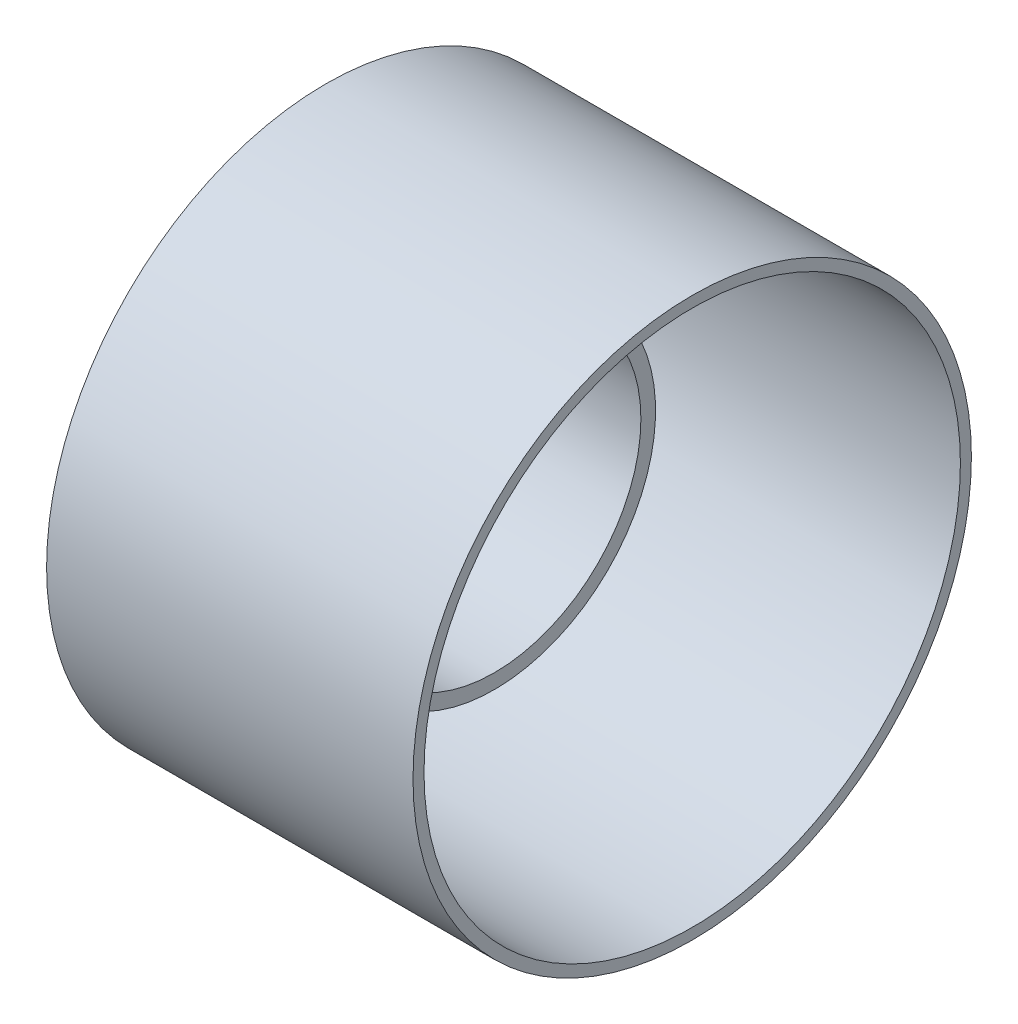
ISO-10303-21;
HEADER;
FILE_DESCRIPTION(('STEP AP214'),'2;1');
FILE_NAME('part.step','',(''),(''),'','','');
FILE_SCHEMA(('AUTOMOTIVE_DESIGN { 1 0 10303 214 1 1 1 1 }'));
ENDSEC;
DATA;
#1=APPLICATION_CONTEXT('core data for automotive mechanical design processes');
#2=APPLICATION_PROTOCOL_DEFINITION('international standard','automotive_design',2000,#1);
#3=PRODUCT_CONTEXT('',#1,'mechanical');
#4=PRODUCT('Part','Part','',(#3));
#5=PRODUCT_RELATED_PRODUCT_CATEGORY('part','',(#4));
#6=PRODUCT_DEFINITION_FORMATION('','',#4);
#7=PRODUCT_DEFINITION_CONTEXT('part definition',#1,'design');
#8=PRODUCT_DEFINITION('design','',#6,#7);
#9=PRODUCT_DEFINITION_SHAPE('','',#8);
#10=(LENGTH_UNIT() NAMED_UNIT(*) SI_UNIT(.MILLI.,.METRE.));
#11=(NAMED_UNIT(*) PLANE_ANGLE_UNIT() SI_UNIT($,.RADIAN.));
#12=(NAMED_UNIT(*) SI_UNIT($,.STERADIAN.) SOLID_ANGLE_UNIT());
#13=UNCERTAINTY_MEASURE_WITH_UNIT(LENGTH_MEASURE(1.E-05),#10,'distance_accuracy_value','');
#14=(GEOMETRIC_REPRESENTATION_CONTEXT(3) GLOBAL_UNCERTAINTY_ASSIGNED_CONTEXT((#13)) GLOBAL_UNIT_ASSIGNED_CONTEXT((#10,
#11,#12)) REPRESENTATION_CONTEXT('',''));
#15=CARTESIAN_POINT('',(0.,0.,0.));
#16=DIRECTION('',(0.,0.,1.));
#17=DIRECTION('',(1.,0.,0.));
#18=AXIS2_PLACEMENT_3D('',#15,#16,#17);
#19=CARTESIAN_POINT('',(100.,76.2,0.));
#20=DIRECTION('',(-1.,0.,0.));
#21=DIRECTION('',(0.,0.,1.));
#22=AXIS2_PLACEMENT_3D('',#19,#20,#21);
#23=PLANE('',#22);
#24=CARTESIAN_POINT('',(100.,0.,0.));
#25=DIRECTION('',(-1.,0.,0.));
#26=DIRECTION('',(0.,0.,1.));
#27=AXIS2_PLACEMENT_3D('',#24,#25,#26);
#28=CIRCLE('',#27,76.2);
#29=CARTESIAN_POINT('',(100.,0.,76.2));
#30=VERTEX_POINT('',#29);
#31=EDGE_CURVE('E10',#30,#30,#28,.T.);
#32=ORIENTED_EDGE('',*,*,#31,.F.);
#33=EDGE_LOOP('',(#32));
#34=FACE_BOUND('',#33,.T.);
#35=CARTESIAN_POINT('',(100.,0.,0.));
#36=DIRECTION('',(-1.,0.,0.));
#37=DIRECTION('',(0.,0.,1.));
#38=AXIS2_PLACEMENT_3D('',#35,#36,#37);
#39=CIRCLE('',#38,73.2);
#40=CARTESIAN_POINT('',(100.,0.,73.2));
#41=VERTEX_POINT('',#40);
#42=EDGE_CURVE('E40',#41,#41,#39,.T.);
#43=ORIENTED_EDGE('',*,*,#42,.T.);
#44=EDGE_LOOP('',(#43));
#45=FACE_BOUND('',#44,.T.);
#46=ADVANCED_FACE('F34',(#34,#45),#23,.F.);
#47=CARTESIAN_POINT('',(0.,0.,0.));
#48=DIRECTION('',(-1.,0.,0.));
#49=DIRECTION('',(0.,0.,1.));
#50=AXIS2_PLACEMENT_3D('',#47,#48,#49);
#51=CYLINDRICAL_SURFACE('',#50,73.2);
#52=ORIENTED_EDGE('',*,*,#42,.F.);
#53=EDGE_LOOP('',(#52));
#54=FACE_BOUND('',#53,.T.);
#55=CARTESIAN_POINT('',(8.00000000000001,0.,0.));
#56=DIRECTION('',(-1.,0.,0.));
#57=DIRECTION('',(0.,0.,1.));
#58=AXIS2_PLACEMENT_3D('',#55,#56,#57);
#59=CIRCLE('',#58,73.2);
#60=CARTESIAN_POINT('',(8.00000000000001,0.,73.2));
#61=VERTEX_POINT('',#60);
#62=EDGE_CURVE('E44',#61,#61,#59,.T.);
#63=ORIENTED_EDGE('',*,*,#62,.T.);
#64=EDGE_LOOP('',(#63));
#65=FACE_BOUND('',#64,.T.);
#66=ADVANCED_FACE('F93',(#54,#65),#51,.F.);
#67=CARTESIAN_POINT('',(8.,0.,0.));
#68=DIRECTION('',(-1.,0.,0.));
#69=DIRECTION('',(0.,0.,1.));
#70=AXIS2_PLACEMENT_3D('',#67,#68,#69);
#71=TOROIDAL_SURFACE('',#70,71.2,2.);
#72=ORIENTED_EDGE('',*,*,#62,.F.);
#73=EDGE_LOOP('',(#72));
#74=FACE_BOUND('',#73,.T.);
#75=CARTESIAN_POINT('',(6.,0.,0.));
#76=DIRECTION('',(-1.,0.,0.));
#77=DIRECTION('',(0.,0.,1.));
#78=AXIS2_PLACEMENT_3D('',#75,#76,#77);
#79=CIRCLE('',#78,71.2);
#80=CARTESIAN_POINT('',(6.,0.,71.2));
#81=VERTEX_POINT('',#80);
#82=EDGE_CURVE('E48',#81,#81,#79,.T.);
#83=ORIENTED_EDGE('',*,*,#82,.T.);
#84=EDGE_LOOP('',(#83));
#85=FACE_BOUND('',#84,.T.);
#86=ADVANCED_FACE('F98',(#74,#85),#71,.F.);
#87=CARTESIAN_POINT('',(6.,47.9024984394501,0.));
#88=DIRECTION('',(-1.,0.,0.));
#89=DIRECTION('',(0.,0.,1.));
#90=AXIS2_PLACEMENT_3D('',#87,#88,#89);
#91=PLANE('',#90);
#92=ORIENTED_EDGE('',*,*,#82,.F.);
#93=EDGE_LOOP('',(#92));
#94=FACE_BOUND('',#93,.T.);
#95=CARTESIAN_POINT('',(6.,0.,0.));
#96=DIRECTION('',(-1.,0.,0.));
#97=DIRECTION('',(0.,0.,1.));
#98=AXIS2_PLACEMENT_3D('',#95,#96,#97);
#99=CIRCLE('',#98,47.9024984394501);
#100=CARTESIAN_POINT('',(6.,0.,47.9024984394501));
#101=VERTEX_POINT('',#100);
#102=EDGE_CURVE('E53',#101,#101,#99,.T.);
#103=ORIENTED_EDGE('',*,*,#102,.T.);
#104=EDGE_LOOP('',(#103));
#105=FACE_BOUND('',#104,.T.);
#106=ADVANCED_FACE('F103',(#94,#105),#91,.F.);
#107=CARTESIAN_POINT('',(8.,0.,0.));
#108=DIRECTION('',(-1.,0.,0.));
#109=DIRECTION('',(0.,0.,1.));
#110=AXIS2_PLACEMENT_3D('',#107,#108,#109);
#111=TOROIDAL_SURFACE('',#110,47.9024984394501,2.);
#112=ORIENTED_EDGE('',*,*,#102,.F.);
#113=EDGE_LOOP('',(#112));
#114=FACE_BOUND('',#113,.T.);
#115=CARTESIAN_POINT('',(7.90012476611223,0.,0.));
#116=DIRECTION('',(-1.,0.,0.));
#117=DIRECTION('',(0.,0.,1.));
#118=AXIS2_PLACEMENT_3D('',#115,#116,#117);
#119=CIRCLE('',#118,45.9049937616944);
#120=CARTESIAN_POINT('',(7.90012476611223,0.,45.9049937616944));
#121=VERTEX_POINT('',#120);
#122=EDGE_CURVE('E56',#121,#121,#119,.T.);
#123=ORIENTED_EDGE('',*,*,#122,.T.);
#124=EDGE_LOOP('',(#123));
#125=FACE_BOUND('',#124,.T.);
#126=ADVANCED_FACE('F110',(#114,#125),#111,.F.);
#127=CARTESIAN_POINT('',(46.,0.,0.));
#128=DIRECTION('',(-1.,0.,0.));
#129=DIRECTION('',(0.,0.,1.));
#130=AXIS2_PLACEMENT_3D('',#127,#128,#129);
#131=CONICAL_SURFACE('',#130,44.,0.0499583957219428);
#132=ORIENTED_EDGE('',*,*,#122,.F.);
#133=EDGE_LOOP('',(#132));
#134=FACE_BOUND('',#133,.T.);
#135=CARTESIAN_POINT('',(46.,0.,0.));
#136=DIRECTION('',(-1.,0.,0.));
#137=DIRECTION('',(0.,0.,1.));
#138=AXIS2_PLACEMENT_3D('',#135,#136,#137);
#139=CIRCLE('',#138,44.);
#140=CARTESIAN_POINT('',(46.,0.,44.));
#141=VERTEX_POINT('',#140);
#142=EDGE_CURVE('E59',#141,#141,#139,.T.);
#143=ORIENTED_EDGE('',*,*,#142,.T.);
#144=EDGE_LOOP('',(#143));
#145=FACE_BOUND('',#144,.T.);
#146=ADVANCED_FACE('F114',(#134,#145),#131,.T.);
#147=CARTESIAN_POINT('',(46.,40.,0.));
#148=DIRECTION('',(-1.,0.,0.));
#149=DIRECTION('',(0.,0.,1.));
#150=AXIS2_PLACEMENT_3D('',#147,#148,#149);
#151=PLANE('',#150);
#152=ORIENTED_EDGE('',*,*,#142,.F.);
#153=EDGE_LOOP('',(#152));
#154=FACE_BOUND('',#153,.T.);
#155=CARTESIAN_POINT('',(46.,0.,0.));
#156=DIRECTION('',(-1.,0.,0.));
#157=DIRECTION('',(0.,0.,1.));
#158=AXIS2_PLACEMENT_3D('',#155,#156,#157);
#159=CIRCLE('',#158,40.);
#160=CARTESIAN_POINT('',(46.,0.,40.));
#161=VERTEX_POINT('',#160);
#162=EDGE_CURVE('E62',#161,#161,#159,.T.);
#163=ORIENTED_EDGE('',*,*,#162,.T.);
#164=EDGE_LOOP('',(#163));
#165=FACE_BOUND('',#164,.T.);
#166=ADVANCED_FACE('F118',(#154,#165),#151,.F.);
#167=CARTESIAN_POINT('',(0.,0.,0.));
#168=DIRECTION('',(-1.,0.,0.));
#169=DIRECTION('',(0.,0.,1.));
#170=AXIS2_PLACEMENT_3D('',#167,#168,#169);
#171=CYLINDRICAL_SURFACE('',#170,40.);
#172=ORIENTED_EDGE('',*,*,#162,.F.);
#173=EDGE_LOOP('',(#172));
#174=FACE_BOUND('',#173,.T.);
#175=CARTESIAN_POINT('',(8.00000000000001,0.,0.));
#176=DIRECTION('',(-1.,0.,0.));
#177=DIRECTION('',(0.,0.,1.));
#178=AXIS2_PLACEMENT_3D('',#175,#176,#177);
#179=CIRCLE('',#178,40.);
#180=CARTESIAN_POINT('',(8.00000000000001,0.,40.));
#181=VERTEX_POINT('',#180);
#182=EDGE_CURVE('E65',#181,#181,#179,.T.);
#183=ORIENTED_EDGE('',*,*,#182,.T.);
#184=EDGE_LOOP('',(#183));
#185=FACE_BOUND('',#184,.T.);
#186=ADVANCED_FACE('F122',(#174,#185),#171,.F.);
#187=CARTESIAN_POINT('',(8.,0.,0.));
#188=DIRECTION('',(-1.,0.,0.));
#189=DIRECTION('',(0.,0.,1.));
#190=AXIS2_PLACEMENT_3D('',#187,#188,#189);
#191=TOROIDAL_SURFACE('',#190,38.,2.);
#192=ORIENTED_EDGE('',*,*,#182,.F.);
#193=EDGE_LOOP('',(#192));
#194=FACE_BOUND('',#193,.T.);
#195=CARTESIAN_POINT('',(6.,0.,0.));
#196=DIRECTION('',(-1.,0.,0.));
#197=DIRECTION('',(0.,0.,1.));
#198=AXIS2_PLACEMENT_3D('',#195,#196,#197);
#199=CIRCLE('',#198,38.);
#200=CARTESIAN_POINT('',(6.,0.,38.));
#201=VERTEX_POINT('',#200);
#202=EDGE_CURVE('E68',#201,#201,#199,.T.);
#203=ORIENTED_EDGE('',*,*,#202,.T.);
#204=EDGE_LOOP('',(#203));
#205=FACE_BOUND('',#204,.T.);
#206=ADVANCED_FACE('F126',(#194,#205),#191,.F.);
#207=CARTESIAN_POINT('',(6.,2.,0.));
#208=DIRECTION('',(-1.,0.,0.));
#209=DIRECTION('',(0.,0.,1.));
#210=AXIS2_PLACEMENT_3D('',#207,#208,#209);
#211=PLANE('',#210);
#212=ORIENTED_EDGE('',*,*,#202,.F.);
#213=EDGE_LOOP('',(#212));
#214=FACE_BOUND('',#213,.T.);
#215=CARTESIAN_POINT('',(6.,0.,0.));
#216=DIRECTION('',(-1.,0.,0.));
#217=DIRECTION('',(0.,0.,1.));
#218=AXIS2_PLACEMENT_3D('',#215,#216,#217);
#219=CIRCLE('',#218,2.);
#220=CARTESIAN_POINT('',(6.,0.,2.));
#221=VERTEX_POINT('',#220);
#222=EDGE_CURVE('E71',#221,#221,#219,.T.);
#223=ORIENTED_EDGE('',*,*,#222,.T.);
#224=EDGE_LOOP('',(#223));
#225=FACE_BOUND('',#224,.T.);
#226=ADVANCED_FACE('F130',(#214,#225),#211,.F.);
#227=CARTESIAN_POINT('',(0.,0.,0.));
#228=DIRECTION('',(-1.,0.,0.));
#229=DIRECTION('',(0.,0.,1.));
#230=AXIS2_PLACEMENT_3D('',#227,#228,#229);
#231=CYLINDRICAL_SURFACE('',#230,2.);
#232=ORIENTED_EDGE('',*,*,#222,.F.);
#233=EDGE_LOOP('',(#232));
#234=FACE_BOUND('',#233,.T.);
#235=CARTESIAN_POINT('',(0.,0.,0.));
#236=DIRECTION('',(-1.,0.,0.));
#237=DIRECTION('',(0.,0.,1.));
#238=AXIS2_PLACEMENT_3D('',#235,#236,#237);
#239=CIRCLE('',#238,2.);
#240=CARTESIAN_POINT('',(0.,0.,2.));
#241=VERTEX_POINT('',#240);
#242=EDGE_CURVE('E74',#241,#241,#239,.T.);
#243=ORIENTED_EDGE('',*,*,#242,.T.);
#244=EDGE_LOOP('',(#243));
#245=FACE_BOUND('',#244,.T.);
#246=ADVANCED_FACE('F89',(#234,#245),#231,.F.);
#247=CARTESIAN_POINT('',(0.,2.,0.));
#248=DIRECTION('',(1.,0.,0.));
#249=DIRECTION('',(0.,0.,-1.));
#250=AXIS2_PLACEMENT_3D('',#247,#248,#249);
#251=PLANE('',#250);
#252=ORIENTED_EDGE('',*,*,#242,.F.);
#253=EDGE_LOOP('',(#252));
#254=FACE_BOUND('',#253,.T.);
#255=CARTESIAN_POINT('',(0.,0.,0.));
#256=DIRECTION('',(-1.,0.,0.));
#257=DIRECTION('',(0.,0.,1.));
#258=AXIS2_PLACEMENT_3D('',#255,#256,#257);
#259=CIRCLE('',#258,76.2);
#260=CARTESIAN_POINT('',(0.,0.,76.2));
#261=VERTEX_POINT('',#260);
#262=EDGE_CURVE('E77',#261,#261,#259,.T.);
#263=ORIENTED_EDGE('',*,*,#262,.T.);
#264=EDGE_LOOP('',(#263));
#265=FACE_BOUND('',#264,.T.);
#266=ADVANCED_FACE('F81',(#254,#265),#251,.F.);
#267=CARTESIAN_POINT('',(0.,0.,0.));
#268=DIRECTION('',(-1.,0.,0.));
#269=DIRECTION('',(0.,0.,1.));
#270=AXIS2_PLACEMENT_3D('',#267,#268,#269);
#271=CYLINDRICAL_SURFACE('',#270,76.2);
#272=ORIENTED_EDGE('',*,*,#262,.F.);
#273=EDGE_LOOP('',(#272));
#274=FACE_BOUND('',#273,.T.);
#275=ORIENTED_EDGE('',*,*,#31,.T.);
#276=EDGE_LOOP('',(#275));
#277=FACE_BOUND('',#276,.T.);
#278=ADVANCED_FACE('F83',(#274,#277),#271,.T.);
#279=CLOSED_SHELL('',(#46,#66,#86,#106,#126,#146,#166,#186,#206,#226,#246,#266,#278));
#280=MANIFOLD_SOLID_BREP('B2',#279);
#281=ADVANCED_BREP_SHAPE_REPRESENTATION('',(#18,#280),#14);
#282=SHAPE_DEFINITION_REPRESENTATION(#9,#281);
ENDSEC;
END-ISO-10303-21;
